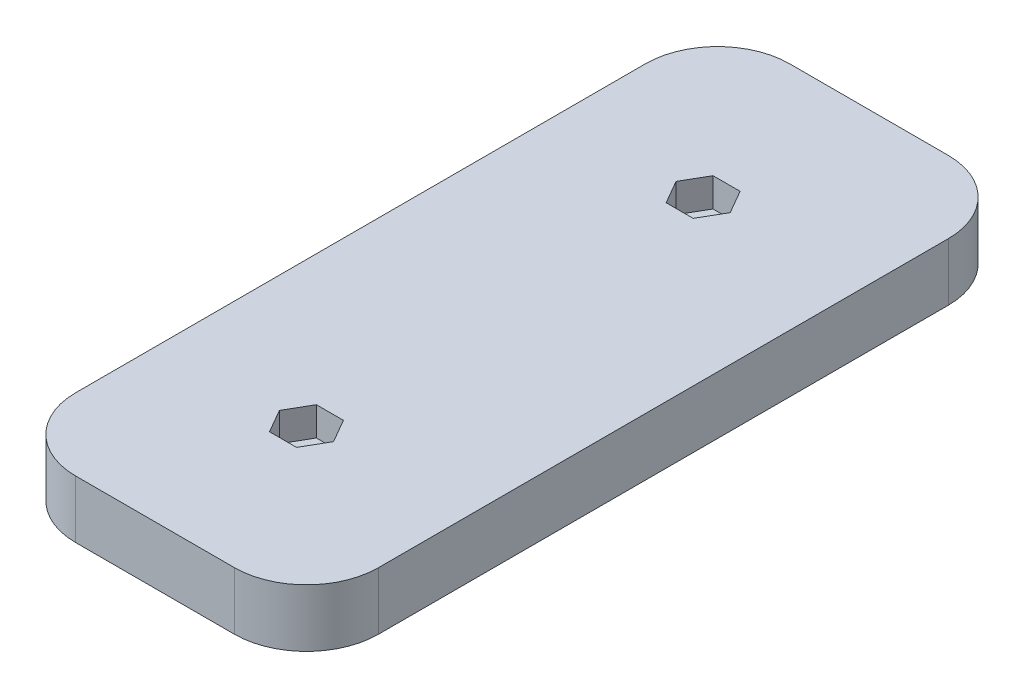
ISO-10303-21;
HEADER;
FILE_DESCRIPTION(('STEP AP214'),'2;1');
FILE_NAME('part.step','',(''),(''),'','','');
FILE_SCHEMA(('AUTOMOTIVE_DESIGN { 1 0 10303 214 1 1 1 1 }'));
ENDSEC;
DATA;
#1=APPLICATION_CONTEXT('core data for automotive mechanical design processes');
#2=APPLICATION_PROTOCOL_DEFINITION('international standard','automotive_design',2000,#1);
#3=PRODUCT_CONTEXT('',#1,'mechanical');
#4=PRODUCT('Part','Part','',(#3));
#5=PRODUCT_RELATED_PRODUCT_CATEGORY('part','',(#4));
#6=PRODUCT_DEFINITION_FORMATION('','',#4);
#7=PRODUCT_DEFINITION_CONTEXT('part definition',#1,'design');
#8=PRODUCT_DEFINITION('design','',#6,#7);
#9=PRODUCT_DEFINITION_SHAPE('','',#8);
#10=(LENGTH_UNIT() NAMED_UNIT(*) SI_UNIT(.MILLI.,.METRE.));
#11=(NAMED_UNIT(*) PLANE_ANGLE_UNIT() SI_UNIT($,.RADIAN.));
#12=(NAMED_UNIT(*) SI_UNIT($,.STERADIAN.) SOLID_ANGLE_UNIT());
#13=UNCERTAINTY_MEASURE_WITH_UNIT(LENGTH_MEASURE(1.E-05),#10,'distance_accuracy_value','');
#14=(GEOMETRIC_REPRESENTATION_CONTEXT(3) GLOBAL_UNCERTAINTY_ASSIGNED_CONTEXT((#13)) GLOBAL_UNIT_ASSIGNED_CONTEXT((#10,
#11,#12)) REPRESENTATION_CONTEXT('',''));
#15=CARTESIAN_POINT('',(0.,0.,0.));
#16=DIRECTION('',(0.,0.,1.));
#17=DIRECTION('',(1.,0.,0.));
#18=AXIS2_PLACEMENT_3D('',#15,#16,#17);
#19=CARTESIAN_POINT('',(20.,8.,-77.));
#20=DIRECTION('',(0.,-1.,0.));
#21=DIRECTION('',(0.,0.,-1.));
#22=AXIS2_PLACEMENT_3D('',#19,#20,#21);
#23=CYLINDRICAL_SURFACE('',#22,2.00000000000001);
#24=CARTESIAN_POINT('',(20.,0.,-77.));
#25=DIRECTION('',(0.,1.,0.));
#26=DIRECTION('',(0.,0.,1.));
#27=AXIS2_PLACEMENT_3D('',#24,#25,#26);
#28=CIRCLE('',#27,2.00000000000001);
#29=CARTESIAN_POINT('',(20.,0.,-75.));
#30=VERTEX_POINT('',#29);
#31=EDGE_CURVE('E310',#30,#30,#28,.T.);
#32=ORIENTED_EDGE('',*,*,#31,.F.);
#33=EDGE_LOOP('',(#32));
#34=FACE_BOUND('',#33,.T.);
#35=CARTESIAN_POINT('',(20.,4.,-77.));
#36=DIRECTION('',(0.,1.,0.));
#37=DIRECTION('',(0.,0.,1.));
#38=AXIS2_PLACEMENT_3D('',#35,#36,#37);
#39=CIRCLE('',#38,2.00000000000001);
#40=CARTESIAN_POINT('',(20.,4.,-75.));
#41=VERTEX_POINT('',#40);
#42=EDGE_CURVE('E302',#41,#41,#39,.T.);
#43=ORIENTED_EDGE('',*,*,#42,.T.);
#44=EDGE_LOOP('',(#43));
#45=FACE_BOUND('',#44,.T.);
#46=ADVANCED_FACE('F39',(#34,#45),#23,.F.);
#47=CARTESIAN_POINT('',(20.,8.,-22.));
#48=DIRECTION('',(0.,-1.,0.));
#49=DIRECTION('',(0.,0.,-1.));
#50=AXIS2_PLACEMENT_3D('',#47,#48,#49);
#51=CYLINDRICAL_SURFACE('',#50,2.00000000000001);
#52=CARTESIAN_POINT('',(20.,0.,-22.));
#53=DIRECTION('',(0.,1.,0.));
#54=DIRECTION('',(0.,0.,1.));
#55=AXIS2_PLACEMENT_3D('',#52,#53,#54);
#56=CIRCLE('',#55,2.00000000000001);
#57=CARTESIAN_POINT('',(20.,0.,-20.));
#58=VERTEX_POINT('',#57);
#59=EDGE_CURVE('E289',#58,#58,#56,.F.);
#60=ORIENTED_EDGE('',*,*,#59,.T.);
#61=EDGE_LOOP('',(#60));
#62=FACE_BOUND('',#61,.T.);
#63=CARTESIAN_POINT('',(20.,4.,-22.));
#64=DIRECTION('',(0.,1.,0.));
#65=DIRECTION('',(0.,0.,1.));
#66=AXIS2_PLACEMENT_3D('',#63,#64,#65);
#67=CIRCLE('',#66,2.00000000000001);
#68=CARTESIAN_POINT('',(20.,4.,-20.));
#69=VERTEX_POINT('',#68);
#70=EDGE_CURVE('E231',#69,#69,#67,.F.);
#71=ORIENTED_EDGE('',*,*,#70,.F.);
#72=EDGE_LOOP('',(#71));
#73=FACE_BOUND('',#72,.T.);
#74=ADVANCED_FACE('F388',(#62,#73),#51,.F.);
#75=CARTESIAN_POINT('',(0.,8.,0.));
#76=DIRECTION('',(0.,0.,-1.));
#77=DIRECTION('',(-1.,0.,0.));
#78=AXIS2_PLACEMENT_3D('',#75,#76,#77);
#79=PLANE('',#78);
#80=DIRECTION('',(1.,0.,0.));
#81=VECTOR('',#80,1.);
#82=CARTESIAN_POINT('',(0.,8.,0.));
#83=LINE('',#82,#81);
#84=CARTESIAN_POINT('',(10.,8.,0.));
#85=VERTEX_POINT('',#84);
#86=CARTESIAN_POINT('',(32.,8.,0.));
#87=VERTEX_POINT('',#86);
#88=EDGE_CURVE('E286',#85,#87,#83,.T.);
#89=ORIENTED_EDGE('',*,*,#88,.F.);
#90=DIRECTION('',(0.,-1.,0.));
#91=VECTOR('',#90,1.);
#92=CARTESIAN_POINT('',(10.,0.,0.));
#93=LINE('',#92,#91);
#94=CARTESIAN_POINT('',(10.,0.,0.));
#95=VERTEX_POINT('',#94);
#96=EDGE_CURVE('E11',#85,#95,#93,.T.);
#97=ORIENTED_EDGE('',*,*,#96,.T.);
#98=DIRECTION('',(1.,0.,0.));
#99=VECTOR('',#98,1.);
#100=CARTESIAN_POINT('',(0.,0.,0.));
#101=LINE('',#100,#99);
#102=CARTESIAN_POINT('',(32.,0.,0.));
#103=VERTEX_POINT('',#102);
#104=EDGE_CURVE('E298',#95,#103,#101,.T.);
#105=ORIENTED_EDGE('',*,*,#104,.T.);
#106=DIRECTION('',(0.,-1.,0.));
#107=VECTOR('',#106,1.);
#108=CARTESIAN_POINT('',(32.,8.,0.));
#109=LINE('',#108,#107);
#110=EDGE_CURVE('E47',#103,#87,#109,.F.);
#111=ORIENTED_EDGE('',*,*,#110,.T.);
#112=EDGE_LOOP('',(#89,#97,#105,#111));
#113=FACE_BOUND('',#112,.T.);
#114=ADVANCED_FACE('F349',(#113),#79,.F.);
#115=CARTESIAN_POINT('',(42.,8.,0.));
#116=DIRECTION('',(-1.,0.,0.));
#117=DIRECTION('',(0.,0.,1.));
#118=AXIS2_PLACEMENT_3D('',#115,#116,#117);
#119=PLANE('',#118);
#120=DIRECTION('',(0.,0.,-1.));
#121=VECTOR('',#120,1.);
#122=CARTESIAN_POINT('',(42.,0.,0.));
#123=LINE('',#122,#121);
#124=CARTESIAN_POINT('',(42.,0.,-10.));
#125=VERTEX_POINT('',#124);
#126=CARTESIAN_POINT('',(42.,0.,-89.));
#127=VERTEX_POINT('',#126);
#128=EDGE_CURVE('E301',#125,#127,#123,.T.);
#129=ORIENTED_EDGE('',*,*,#128,.T.);
#130=DIRECTION('',(0.,-1.,0.));
#131=VECTOR('',#130,1.);
#132=CARTESIAN_POINT('',(42.,8.,-89.));
#133=LINE('',#132,#131);
#134=CARTESIAN_POINT('',(42.,8.,-89.));
#135=VERTEX_POINT('',#134);
#136=EDGE_CURVE('E54',#127,#135,#133,.F.);
#137=ORIENTED_EDGE('',*,*,#136,.T.);
#138=DIRECTION('',(0.,0.,-1.));
#139=VECTOR('',#138,1.);
#140=CARTESIAN_POINT('',(42.,8.,0.));
#141=LINE('',#140,#139);
#142=CARTESIAN_POINT('',(42.,8.,-10.));
#143=VERTEX_POINT('',#142);
#144=EDGE_CURVE('E288',#143,#135,#141,.T.);
#145=ORIENTED_EDGE('',*,*,#144,.F.);
#146=DIRECTION('',(0.,-1.,0.));
#147=VECTOR('',#146,1.);
#148=CARTESIAN_POINT('',(42.,8.,-10.));
#149=LINE('',#148,#147);
#150=EDGE_CURVE('E343',#143,#125,#149,.T.);
#151=ORIENTED_EDGE('',*,*,#150,.T.);
#152=EDGE_LOOP('',(#129,#137,#145,#151));
#153=FACE_BOUND('',#152,.T.);
#154=ADVANCED_FACE('F359',(#153),#119,.F.);
#155=CARTESIAN_POINT('',(0.,8.,-99.));
#156=DIRECTION('',(0.,0.,-1.));
#157=DIRECTION('',(-1.,0.,0.));
#158=AXIS2_PLACEMENT_3D('',#155,#156,#157);
#159=PLANE('',#158);
#160=DIRECTION('',(1.,0.,0.));
#161=VECTOR('',#160,1.);
#162=CARTESIAN_POINT('',(0.,0.,-99.));
#163=LINE('',#162,#161);
#164=CARTESIAN_POINT('',(10.,0.,-99.));
#165=VERTEX_POINT('',#164);
#166=CARTESIAN_POINT('',(32.,0.,-99.));
#167=VERTEX_POINT('',#166);
#168=EDGE_CURVE('E304',#165,#167,#163,.T.);
#169=ORIENTED_EDGE('',*,*,#168,.F.);
#170=DIRECTION('',(0.,-1.,0.));
#171=VECTOR('',#170,1.);
#172=CARTESIAN_POINT('',(10.,8.,-99.));
#173=LINE('',#172,#171);
#174=CARTESIAN_POINT('',(10.,8.,-99.));
#175=VERTEX_POINT('',#174);
#176=EDGE_CURVE('E334',#165,#175,#173,.F.);
#177=ORIENTED_EDGE('',*,*,#176,.T.);
#178=DIRECTION('',(1.,0.,0.));
#179=VECTOR('',#178,1.);
#180=CARTESIAN_POINT('',(0.,8.,-99.));
#181=LINE('',#180,#179);
#182=CARTESIAN_POINT('',(32.,8.,-99.));
#183=VERTEX_POINT('',#182);
#184=EDGE_CURVE('E291',#175,#183,#181,.T.);
#185=ORIENTED_EDGE('',*,*,#184,.T.);
#186=DIRECTION('',(0.,-1.,0.));
#187=VECTOR('',#186,1.);
#188=CARTESIAN_POINT('',(32.,0.,-99.));
#189=LINE('',#188,#187);
#190=EDGE_CURVE('E331',#183,#167,#189,.T.);
#191=ORIENTED_EDGE('',*,*,#190,.T.);
#192=EDGE_LOOP('',(#169,#177,#185,#191));
#193=FACE_BOUND('',#192,.T.);
#194=ADVANCED_FACE('F369',(#193),#159,.T.);
#195=CARTESIAN_POINT('',(0.,8.,0.));
#196=DIRECTION('',(-1.,0.,0.));
#197=DIRECTION('',(0.,0.,1.));
#198=AXIS2_PLACEMENT_3D('',#195,#196,#197);
#199=PLANE('',#198);
#200=DIRECTION('',(0.,0.,-1.));
#201=VECTOR('',#200,1.);
#202=CARTESIAN_POINT('',(0.,8.,0.));
#203=LINE('',#202,#201);
#204=CARTESIAN_POINT('',(0.,8.,-10.));
#205=VERTEX_POINT('',#204);
#206=CARTESIAN_POINT('',(0.,8.,-89.));
#207=VERTEX_POINT('',#206);
#208=EDGE_CURVE('E294',#205,#207,#203,.T.);
#209=ORIENTED_EDGE('',*,*,#208,.T.);
#210=DIRECTION('',(0.,-1.,0.));
#211=VECTOR('',#210,1.);
#212=CARTESIAN_POINT('',(0.,8.,-89.));
#213=LINE('',#212,#211);
#214=CARTESIAN_POINT('',(0.,0.,-89.));
#215=VERTEX_POINT('',#214);
#216=EDGE_CURVE('E320',#207,#215,#213,.T.);
#217=ORIENTED_EDGE('',*,*,#216,.T.);
#218=DIRECTION('',(0.,0.,-1.));
#219=VECTOR('',#218,1.);
#220=CARTESIAN_POINT('',(0.,0.,0.));
#221=LINE('',#220,#219);
#222=CARTESIAN_POINT('',(0.,0.,-10.));
#223=VERTEX_POINT('',#222);
#224=EDGE_CURVE('E307',#223,#215,#221,.T.);
#225=ORIENTED_EDGE('',*,*,#224,.F.);
#226=DIRECTION('',(0.,-1.,0.));
#227=VECTOR('',#226,1.);
#228=CARTESIAN_POINT('',(0.,8.,-10.));
#229=LINE('',#228,#227);
#230=EDGE_CURVE('E297',#223,#205,#229,.F.);
#231=ORIENTED_EDGE('',*,*,#230,.T.);
#232=EDGE_LOOP('',(#209,#217,#225,#231));
#233=FACE_BOUND('',#232,.T.);
#234=ADVANCED_FACE('F377',(#233),#199,.T.);
#235=CARTESIAN_POINT('',(0.,8.,0.));
#236=DIRECTION('',(0.,1.,0.));
#237=DIRECTION('',(0.,0.,1.));
#238=AXIS2_PLACEMENT_3D('',#235,#236,#237);
#239=PLANE('',#238);
#240=DIRECTION('',(0.5,0.,-0.866025403784439));
#241=VECTOR('',#240,1.);
#242=CARTESIAN_POINT('',(21.8763883748663,8.,-18.75));
#243=LINE('',#242,#241);
#244=CARTESIAN_POINT('',(21.8763883748663,8.,-18.75));
#245=VERTEX_POINT('',#244);
#246=CARTESIAN_POINT('',(23.7527767497326,8.,-22.));
#247=VERTEX_POINT('',#246);
#248=EDGE_CURVE('E185',#245,#247,#243,.T.);
#249=ORIENTED_EDGE('',*,*,#248,.F.);
#250=DIRECTION('',(1.,0.,0.));
#251=VECTOR('',#250,1.);
#252=CARTESIAN_POINT('',(18.1236116251337,8.,-18.75));
#253=LINE('',#252,#251);
#254=CARTESIAN_POINT('',(18.1236116251337,8.,-18.75));
#255=VERTEX_POINT('',#254);
#256=EDGE_CURVE('E204',#255,#245,#253,.T.);
#257=ORIENTED_EDGE('',*,*,#256,.F.);
#258=DIRECTION('',(0.5,0.,0.866025403784439));
#259=VECTOR('',#258,1.);
#260=CARTESIAN_POINT('',(16.2472232502674,8.,-22.));
#261=LINE('',#260,#259);
#262=CARTESIAN_POINT('',(16.2472232502674,8.,-22.));
#263=VERTEX_POINT('',#262);
#264=EDGE_CURVE('E207',#263,#255,#261,.T.);
#265=ORIENTED_EDGE('',*,*,#264,.F.);
#266=DIRECTION('',(-0.5,0.,0.866025403784439));
#267=VECTOR('',#266,1.);
#268=CARTESIAN_POINT('',(18.1236116251337,8.,-25.25));
#269=LINE('',#268,#267);
#270=CARTESIAN_POINT('',(18.1236116251337,8.,-25.25));
#271=VERTEX_POINT('',#270);
#272=EDGE_CURVE('E224',#271,#263,#269,.T.);
#273=ORIENTED_EDGE('',*,*,#272,.F.);
#274=DIRECTION('',(-1.,0.,0.));
#275=VECTOR('',#274,1.);
#276=CARTESIAN_POINT('',(21.8763883748663,8.,-25.25));
#277=LINE('',#276,#275);
#278=CARTESIAN_POINT('',(21.8763883748663,8.,-25.25));
#279=VERTEX_POINT('',#278);
#280=EDGE_CURVE('E221',#279,#271,#277,.T.);
#281=ORIENTED_EDGE('',*,*,#280,.F.);
#282=DIRECTION('',(-0.5,0.,-0.866025403784439));
#283=VECTOR('',#282,1.);
#284=CARTESIAN_POINT('',(23.7527767497326,8.,-22.));
#285=LINE('',#284,#283);
#286=EDGE_CURVE('E218',#247,#279,#285,.T.);
#287=ORIENTED_EDGE('',*,*,#286,.F.);
#288=EDGE_LOOP('',(#249,#257,#265,#273,#281,#287));
#289=FACE_BOUND('',#288,.T.);
#290=DIRECTION('',(0.500000000000001,0.,-0.866025403784438));
#291=VECTOR('',#290,1.);
#292=CARTESIAN_POINT('',(21.8763883748663,8.,-73.75));
#293=LINE('',#292,#291);
#294=CARTESIAN_POINT('',(21.8763883748663,8.,-73.75));
#295=VERTEX_POINT('',#294);
#296=CARTESIAN_POINT('',(23.7527767497326,8.,-77.));
#297=VERTEX_POINT('',#296);
#298=EDGE_CURVE('E219',#295,#297,#293,.T.);
#299=ORIENTED_EDGE('',*,*,#298,.F.);
#300=DIRECTION('',(1.,0.,0.));
#301=VECTOR('',#300,1.);
#302=CARTESIAN_POINT('',(18.1236116251337,8.,-73.75));
#303=LINE('',#302,#301);
#304=CARTESIAN_POINT('',(18.1236116251337,8.,-73.75));
#305=VERTEX_POINT('',#304);
#306=EDGE_CURVE('E253',#305,#295,#303,.T.);
#307=ORIENTED_EDGE('',*,*,#306,.F.);
#308=DIRECTION('',(0.5,0.,0.866025403784439));
#309=VECTOR('',#308,1.);
#310=CARTESIAN_POINT('',(16.2472232502674,8.,-77.));
#311=LINE('',#310,#309);
#312=CARTESIAN_POINT('',(16.2472232502674,8.,-77.));
#313=VERTEX_POINT('',#312);
#314=EDGE_CURVE('E256',#313,#305,#311,.T.);
#315=ORIENTED_EDGE('',*,*,#314,.F.);
#316=DIRECTION('',(-0.499999999999999,0.,0.866025403784439));
#317=VECTOR('',#316,1.);
#318=CARTESIAN_POINT('',(18.1236116251337,8.,-80.25));
#319=LINE('',#318,#317);
#320=CARTESIAN_POINT('',(18.1236116251337,8.,-80.25));
#321=VERTEX_POINT('',#320);
#322=EDGE_CURVE('E260',#321,#313,#319,.T.);
#323=ORIENTED_EDGE('',*,*,#322,.F.);
#324=DIRECTION('',(-1.,0.,0.));
#325=VECTOR('',#324,1.);
#326=CARTESIAN_POINT('',(21.8763883748663,8.,-80.25));
#327=LINE('',#326,#325);
#328=CARTESIAN_POINT('',(21.8763883748663,8.,-80.25));
#329=VERTEX_POINT('',#328);
#330=EDGE_CURVE('E263',#329,#321,#327,.T.);
#331=ORIENTED_EDGE('',*,*,#330,.F.);
#332=DIRECTION('',(-0.5,0.,-0.866025403784439));
#333=VECTOR('',#332,1.);
#334=CARTESIAN_POINT('',(23.7527767497326,8.,-77.));
#335=LINE('',#334,#333);
#336=EDGE_CURVE('E266',#297,#329,#335,.T.);
#337=ORIENTED_EDGE('',*,*,#336,.F.);
#338=EDGE_LOOP('',(#299,#307,#315,#323,#331,#337));
#339=FACE_BOUND('',#338,.T.);
#340=ORIENTED_EDGE('',*,*,#184,.F.);
#341=CARTESIAN_POINT('',(10.,8.,-89.));
#342=DIRECTION('',(0.,1.,0.));
#343=DIRECTION('',(0.,0.,1.));
#344=AXIS2_PLACEMENT_3D('',#341,#342,#343);
#345=CIRCLE('',#344,10.);
#346=EDGE_CURVE('E341',#175,#207,#345,.T.);
#347=ORIENTED_EDGE('',*,*,#346,.T.);
#348=ORIENTED_EDGE('',*,*,#208,.F.);
#349=CARTESIAN_POINT('',(10.,8.,-10.));
#350=DIRECTION('',(0.,1.,0.));
#351=DIRECTION('',(0.,0.,1.));
#352=AXIS2_PLACEMENT_3D('',#349,#350,#351);
#353=CIRCLE('',#352,10.);
#354=EDGE_CURVE('E337',#205,#85,#353,.T.);
#355=ORIENTED_EDGE('',*,*,#354,.T.);
#356=ORIENTED_EDGE('',*,*,#88,.T.);
#357=CARTESIAN_POINT('',(32.,8.,-10.));
#358=DIRECTION('',(0.,1.,0.));
#359=DIRECTION('',(0.,0.,1.));
#360=AXIS2_PLACEMENT_3D('',#357,#358,#359);
#361=CIRCLE('',#360,10.);
#362=EDGE_CURVE('E61',#87,#143,#361,.T.);
#363=ORIENTED_EDGE('',*,*,#362,.T.);
#364=ORIENTED_EDGE('',*,*,#144,.T.);
#365=CARTESIAN_POINT('',(32.,8.,-89.));
#366=DIRECTION('',(0.,1.,0.));
#367=DIRECTION('',(0.,0.,1.));
#368=AXIS2_PLACEMENT_3D('',#365,#366,#367);
#369=CIRCLE('',#368,10.);
#370=EDGE_CURVE('E339',#135,#183,#369,.T.);
#371=ORIENTED_EDGE('',*,*,#370,.T.);
#372=EDGE_LOOP('',(#340,#347,#348,#355,#356,#363,#364,#371));
#373=FACE_BOUND('',#372,.T.);
#374=ADVANCED_FACE('F354',(#289,#339,#373),#239,.T.);
#375=CARTESIAN_POINT('',(0.,0.,0.));
#376=DIRECTION('',(0.,1.,0.));
#377=DIRECTION('',(0.,0.,1.));
#378=AXIS2_PLACEMENT_3D('',#375,#376,#377);
#379=PLANE('',#378);
#380=ORIENTED_EDGE('',*,*,#224,.T.);
#381=CARTESIAN_POINT('',(10.,0.,-89.));
#382=DIRECTION('',(0.,1.,0.));
#383=DIRECTION('',(0.,0.,1.));
#384=AXIS2_PLACEMENT_3D('',#381,#382,#383);
#385=CIRCLE('',#384,10.);
#386=EDGE_CURVE('E329',#215,#165,#385,.F.);
#387=ORIENTED_EDGE('',*,*,#386,.T.);
#388=ORIENTED_EDGE('',*,*,#168,.T.);
#389=CARTESIAN_POINT('',(32.,0.,-89.));
#390=DIRECTION('',(0.,1.,0.));
#391=DIRECTION('',(0.,0.,1.));
#392=AXIS2_PLACEMENT_3D('',#389,#390,#391);
#393=CIRCLE('',#392,10.);
#394=EDGE_CURVE('E327',#167,#127,#393,.F.);
#395=ORIENTED_EDGE('',*,*,#394,.T.);
#396=ORIENTED_EDGE('',*,*,#128,.F.);
#397=CARTESIAN_POINT('',(32.,0.,-10.));
#398=DIRECTION('',(0.,1.,0.));
#399=DIRECTION('',(0.,0.,1.));
#400=AXIS2_PLACEMENT_3D('',#397,#398,#399);
#401=CIRCLE('',#400,10.);
#402=EDGE_CURVE('E323',#125,#103,#401,.F.);
#403=ORIENTED_EDGE('',*,*,#402,.T.);
#404=ORIENTED_EDGE('',*,*,#104,.F.);
#405=CARTESIAN_POINT('',(10.,0.,-10.));
#406=DIRECTION('',(0.,1.,0.));
#407=DIRECTION('',(0.,0.,1.));
#408=AXIS2_PLACEMENT_3D('',#405,#406,#407);
#409=CIRCLE('',#408,10.);
#410=EDGE_CURVE('E325',#95,#223,#409,.F.);
#411=ORIENTED_EDGE('',*,*,#410,.T.);
#412=EDGE_LOOP('',(#380,#387,#388,#395,#396,#403,#404,#411));
#413=FACE_BOUND('',#412,.T.);
#414=ORIENTED_EDGE('',*,*,#31,.T.);
#415=EDGE_LOOP('',(#414));
#416=FACE_BOUND('',#415,.T.);
#417=ORIENTED_EDGE('',*,*,#59,.F.);
#418=EDGE_LOOP('',(#417));
#419=FACE_BOUND('',#418,.T.);
#420=ADVANCED_FACE('F361',(#413,#416,#419),#379,.F.);
#421=CARTESIAN_POINT('',(21.8763883748663,4.,-73.75));
#422=DIRECTION('',(0.866025403784438,0.,0.500000000000001));
#423=DIRECTION('',(0.500000000000001,0.,-0.866025403784438));
#424=AXIS2_PLACEMENT_3D('',#421,#422,#423);
#425=PLANE('',#424);
#426=ORIENTED_EDGE('',*,*,#298,.T.);
#427=DIRECTION('',(0.,1.,0.));
#428=VECTOR('',#427,1.);
#429=CARTESIAN_POINT('',(23.7527767497326,4.,-77.));
#430=LINE('',#429,#428);
#431=CARTESIAN_POINT('',(23.7527767497326,4.,-77.));
#432=VERTEX_POINT('',#431);
#433=EDGE_CURVE('E239',#432,#297,#430,.T.);
#434=ORIENTED_EDGE('',*,*,#433,.F.);
#435=DIRECTION('',(0.500000000000001,0.,-0.866025403784438));
#436=VECTOR('',#435,1.);
#437=CARTESIAN_POINT('',(21.8763883748663,4.,-73.75));
#438=LINE('',#437,#436);
#439=CARTESIAN_POINT('',(21.8763883748663,4.,-73.75));
#440=VERTEX_POINT('',#439);
#441=EDGE_CURVE('E257',#440,#432,#438,.T.);
#442=ORIENTED_EDGE('',*,*,#441,.F.);
#443=DIRECTION('',(0.,1.,0.));
#444=VECTOR('',#443,1.);
#445=CARTESIAN_POINT('',(21.8763883748663,4.,-73.75));
#446=LINE('',#445,#444);
#447=EDGE_CURVE('E251',#440,#295,#446,.T.);
#448=ORIENTED_EDGE('',*,*,#447,.T.);
#449=EDGE_LOOP('',(#426,#434,#442,#448));
#450=FACE_BOUND('',#449,.T.);
#451=ADVANCED_FACE('F425',(#450),#425,.F.);
#452=CARTESIAN_POINT('',(18.1236116251337,4.,-73.75));
#453=DIRECTION('',(0.,0.,1.));
#454=DIRECTION('',(1.,0.,0.));
#455=AXIS2_PLACEMENT_3D('',#452,#453,#454);
#456=PLANE('',#455);
#457=ORIENTED_EDGE('',*,*,#306,.T.);
#458=ORIENTED_EDGE('',*,*,#447,.F.);
#459=DIRECTION('',(1.,0.,0.));
#460=VECTOR('',#459,1.);
#461=CARTESIAN_POINT('',(18.1236116251337,4.,-73.75));
#462=LINE('',#461,#460);
#463=CARTESIAN_POINT('',(18.1236116251337,4.,-73.75));
#464=VERTEX_POINT('',#463);
#465=EDGE_CURVE('E242',#464,#440,#462,.T.);
#466=ORIENTED_EDGE('',*,*,#465,.F.);
#467=DIRECTION('',(0.,1.,0.));
#468=VECTOR('',#467,1.);
#469=CARTESIAN_POINT('',(18.1236116251337,4.,-73.75));
#470=LINE('',#469,#468);
#471=EDGE_CURVE('E249',#464,#305,#470,.T.);
#472=ORIENTED_EDGE('',*,*,#471,.T.);
#473=EDGE_LOOP('',(#457,#458,#466,#472));
#474=FACE_BOUND('',#473,.T.);
#475=ADVANCED_FACE('F428',(#474),#456,.F.);
#476=CARTESIAN_POINT('',(16.2472232502674,4.,-77.));
#477=DIRECTION('',(-0.866025403784439,0.,0.5));
#478=DIRECTION('',(0.5,0.,0.866025403784439));
#479=AXIS2_PLACEMENT_3D('',#476,#477,#478);
#480=PLANE('',#479);
#481=ORIENTED_EDGE('',*,*,#314,.T.);
#482=ORIENTED_EDGE('',*,*,#471,.F.);
#483=DIRECTION('',(0.5,0.,0.866025403784439));
#484=VECTOR('',#483,1.);
#485=CARTESIAN_POINT('',(16.2472232502674,4.,-77.));
#486=LINE('',#485,#484);
#487=CARTESIAN_POINT('',(16.2472232502674,4.,-77.));
#488=VERTEX_POINT('',#487);
#489=EDGE_CURVE('E272',#488,#464,#486,.T.);
#490=ORIENTED_EDGE('',*,*,#489,.F.);
#491=DIRECTION('',(0.,1.,0.));
#492=VECTOR('',#491,1.);
#493=CARTESIAN_POINT('',(16.2472232502674,4.,-77.));
#494=LINE('',#493,#492);
#495=EDGE_CURVE('E247',#488,#313,#494,.T.);
#496=ORIENTED_EDGE('',*,*,#495,.T.);
#497=EDGE_LOOP('',(#481,#482,#490,#496));
#498=FACE_BOUND('',#497,.T.);
#499=ADVANCED_FACE('F442',(#498),#480,.F.);
#500=CARTESIAN_POINT('',(18.1236116251337,4.,-80.25));
#501=DIRECTION('',(-0.866025403784439,0.,-0.499999999999999));
#502=DIRECTION('',(-0.499999999999999,0.,0.866025403784439));
#503=AXIS2_PLACEMENT_3D('',#500,#501,#502);
#504=PLANE('',#503);
#505=ORIENTED_EDGE('',*,*,#322,.T.);
#506=ORIENTED_EDGE('',*,*,#495,.F.);
#507=DIRECTION('',(-0.499999999999999,0.,0.866025403784439));
#508=VECTOR('',#507,1.);
#509=CARTESIAN_POINT('',(18.1236116251337,4.,-80.25));
#510=LINE('',#509,#508);
#511=CARTESIAN_POINT('',(18.1236116251337,4.,-80.25));
#512=VERTEX_POINT('',#511);
#513=EDGE_CURVE('E275',#512,#488,#510,.T.);
#514=ORIENTED_EDGE('',*,*,#513,.F.);
#515=DIRECTION('',(0.,1.,0.));
#516=VECTOR('',#515,1.);
#517=CARTESIAN_POINT('',(18.1236116251337,4.,-80.25));
#518=LINE('',#517,#516);
#519=EDGE_CURVE('E245',#512,#321,#518,.T.);
#520=ORIENTED_EDGE('',*,*,#519,.T.);
#521=EDGE_LOOP('',(#505,#506,#514,#520));
#522=FACE_BOUND('',#521,.T.);
#523=ADVANCED_FACE('F438',(#522),#504,.F.);
#524=CARTESIAN_POINT('',(21.8763883748663,4.,-80.25));
#525=DIRECTION('',(0.,0.,-1.));
#526=DIRECTION('',(-1.,0.,0.));
#527=AXIS2_PLACEMENT_3D('',#524,#525,#526);
#528=PLANE('',#527);
#529=ORIENTED_EDGE('',*,*,#330,.T.);
#530=ORIENTED_EDGE('',*,*,#519,.F.);
#531=DIRECTION('',(-1.,0.,0.));
#532=VECTOR('',#531,1.);
#533=CARTESIAN_POINT('',(21.8763883748663,4.,-80.25));
#534=LINE('',#533,#532);
#535=CARTESIAN_POINT('',(21.8763883748663,4.,-80.25));
#536=VERTEX_POINT('',#535);
#537=EDGE_CURVE('E278',#536,#512,#534,.T.);
#538=ORIENTED_EDGE('',*,*,#537,.F.);
#539=DIRECTION('',(0.,1.,0.));
#540=VECTOR('',#539,1.);
#541=CARTESIAN_POINT('',(21.8763883748663,4.,-80.25));
#542=LINE('',#541,#540);
#543=EDGE_CURVE('E243',#536,#329,#542,.T.);
#544=ORIENTED_EDGE('',*,*,#543,.T.);
#545=EDGE_LOOP('',(#529,#530,#538,#544));
#546=FACE_BOUND('',#545,.T.);
#547=ADVANCED_FACE('F434',(#546),#528,.F.);
#548=CARTESIAN_POINT('',(23.7527767497326,4.,-77.));
#549=DIRECTION('',(0.866025403784439,0.,-0.5));
#550=DIRECTION('',(-0.5,0.,-0.866025403784439));
#551=AXIS2_PLACEMENT_3D('',#548,#549,#550);
#552=PLANE('',#551);
#553=ORIENTED_EDGE('',*,*,#336,.T.);
#554=ORIENTED_EDGE('',*,*,#543,.F.);
#555=DIRECTION('',(-0.5,0.,-0.866025403784439));
#556=VECTOR('',#555,1.);
#557=CARTESIAN_POINT('',(23.7527767497326,4.,-77.));
#558=LINE('',#557,#556);
#559=EDGE_CURVE('E281',#432,#536,#558,.T.);
#560=ORIENTED_EDGE('',*,*,#559,.F.);
#561=ORIENTED_EDGE('',*,*,#433,.T.);
#562=EDGE_LOOP('',(#553,#554,#560,#561));
#563=FACE_BOUND('',#562,.T.);
#564=ADVANCED_FACE('F430',(#563),#552,.F.);
#565=CARTESIAN_POINT('',(0.,4.,0.));
#566=DIRECTION('',(0.,1.,0.));
#567=DIRECTION('',(0.,0.,1.));
#568=AXIS2_PLACEMENT_3D('',#565,#566,#567);
#569=PLANE('',#568);
#570=ORIENTED_EDGE('',*,*,#42,.F.);
#571=EDGE_LOOP('',(#570));
#572=FACE_BOUND('',#571,.T.);
#573=ORIENTED_EDGE('',*,*,#441,.T.);
#574=ORIENTED_EDGE('',*,*,#559,.T.);
#575=ORIENTED_EDGE('',*,*,#537,.T.);
#576=ORIENTED_EDGE('',*,*,#513,.T.);
#577=ORIENTED_EDGE('',*,*,#489,.T.);
#578=ORIENTED_EDGE('',*,*,#465,.T.);
#579=EDGE_LOOP('',(#573,#574,#575,#576,#577,#578));
#580=FACE_BOUND('',#579,.T.);
#581=ADVANCED_FACE('F433',(#572,#580),#569,.T.);
#582=CARTESIAN_POINT('',(0.,4.,0.));
#583=DIRECTION('',(0.,1.,0.));
#584=DIRECTION('',(0.,0.,1.));
#585=AXIS2_PLACEMENT_3D('',#582,#583,#584);
#586=PLANE('',#585);
#587=DIRECTION('',(0.5,0.,-0.866025403784439));
#588=VECTOR('',#587,1.);
#589=CARTESIAN_POINT('',(21.8763883748663,4.,-18.75));
#590=LINE('',#589,#588);
#591=CARTESIAN_POINT('',(21.8763883748663,4.,-18.75));
#592=VERTEX_POINT('',#591);
#593=CARTESIAN_POINT('',(23.7527767497326,4.,-22.));
#594=VERTEX_POINT('',#593);
#595=EDGE_CURVE('E182',#592,#594,#590,.T.);
#596=ORIENTED_EDGE('',*,*,#595,.T.);
#597=DIRECTION('',(-0.5,0.,-0.866025403784439));
#598=VECTOR('',#597,1.);
#599=CARTESIAN_POINT('',(23.7527767497326,4.,-22.));
#600=LINE('',#599,#598);
#601=CARTESIAN_POINT('',(21.8763883748663,4.,-25.25));
#602=VERTEX_POINT('',#601);
#603=EDGE_CURVE('E193',#594,#602,#600,.T.);
#604=ORIENTED_EDGE('',*,*,#603,.T.);
#605=DIRECTION('',(-1.,0.,0.));
#606=VECTOR('',#605,1.);
#607=CARTESIAN_POINT('',(21.8763883748663,4.,-25.25));
#608=LINE('',#607,#606);
#609=CARTESIAN_POINT('',(18.1236116251337,4.,-25.25));
#610=VERTEX_POINT('',#609);
#611=EDGE_CURVE('E198',#602,#610,#608,.T.);
#612=ORIENTED_EDGE('',*,*,#611,.T.);
#613=DIRECTION('',(-0.5,0.,0.866025403784439));
#614=VECTOR('',#613,1.);
#615=CARTESIAN_POINT('',(18.1236116251337,4.,-25.25));
#616=LINE('',#615,#614);
#617=CARTESIAN_POINT('',(16.2472232502674,4.,-22.));
#618=VERTEX_POINT('',#617);
#619=EDGE_CURVE('E211',#610,#618,#616,.T.);
#620=ORIENTED_EDGE('',*,*,#619,.T.);
#621=DIRECTION('',(0.5,0.,0.866025403784439));
#622=VECTOR('',#621,1.);
#623=CARTESIAN_POINT('',(16.2472232502674,4.,-22.));
#624=LINE('',#623,#622);
#625=CARTESIAN_POINT('',(18.1236116251337,4.,-18.75));
#626=VERTEX_POINT('',#625);
#627=EDGE_CURVE('E214',#618,#626,#624,.T.);
#628=ORIENTED_EDGE('',*,*,#627,.T.);
#629=DIRECTION('',(1.,0.,0.));
#630=VECTOR('',#629,1.);
#631=CARTESIAN_POINT('',(18.1236116251337,4.,-18.75));
#632=LINE('',#631,#630);
#633=EDGE_CURVE('E190',#626,#592,#632,.T.);
#634=ORIENTED_EDGE('',*,*,#633,.T.);
#635=EDGE_LOOP('',(#596,#604,#612,#620,#628,#634));
#636=FACE_BOUND('',#635,.T.);
#637=ORIENTED_EDGE('',*,*,#70,.T.);
#638=EDGE_LOOP('',(#637));
#639=FACE_BOUND('',#638,.T.);
#640=ADVANCED_FACE('F200',(#636,#639),#586,.T.);
#641=CARTESIAN_POINT('',(21.8763883748663,4.,-18.75));
#642=DIRECTION('',(0.866025403784439,0.,0.5));
#643=DIRECTION('',(0.5,0.,-0.866025403784439));
#644=AXIS2_PLACEMENT_3D('',#641,#642,#643);
#645=PLANE('',#644);
#646=ORIENTED_EDGE('',*,*,#248,.T.);
#647=DIRECTION('',(0.,1.,0.));
#648=VECTOR('',#647,1.);
#649=CARTESIAN_POINT('',(23.7527767497326,4.,-22.));
#650=LINE('',#649,#648);
#651=EDGE_CURVE('E178',#594,#247,#650,.T.);
#652=ORIENTED_EDGE('',*,*,#651,.F.);
#653=ORIENTED_EDGE('',*,*,#595,.F.);
#654=DIRECTION('',(0.,1.,0.));
#655=VECTOR('',#654,1.);
#656=CARTESIAN_POINT('',(21.8763883748663,4.,-18.75));
#657=LINE('',#656,#655);
#658=EDGE_CURVE('E229',#592,#245,#657,.T.);
#659=ORIENTED_EDGE('',*,*,#658,.T.);
#660=EDGE_LOOP('',(#646,#652,#653,#659));
#661=FACE_BOUND('',#660,.T.);
#662=ADVANCED_FACE('F180',(#661),#645,.F.);
#663=CARTESIAN_POINT('',(18.1236116251337,4.,-18.75));
#664=DIRECTION('',(0.,0.,1.));
#665=DIRECTION('',(1.,0.,0.));
#666=AXIS2_PLACEMENT_3D('',#663,#664,#665);
#667=PLANE('',#666);
#668=ORIENTED_EDGE('',*,*,#256,.T.);
#669=ORIENTED_EDGE('',*,*,#658,.F.);
#670=ORIENTED_EDGE('',*,*,#633,.F.);
#671=DIRECTION('',(0.,1.,0.));
#672=VECTOR('',#671,1.);
#673=CARTESIAN_POINT('',(18.1236116251337,4.,-18.75));
#674=LINE('',#673,#672);
#675=EDGE_CURVE('E232',#626,#255,#674,.T.);
#676=ORIENTED_EDGE('',*,*,#675,.T.);
#677=EDGE_LOOP('',(#668,#669,#670,#676));
#678=FACE_BOUND('',#677,.T.);
#679=ADVANCED_FACE('F424',(#678),#667,.F.);
#680=CARTESIAN_POINT('',(16.2472232502674,4.,-22.));
#681=DIRECTION('',(-0.866025403784439,0.,0.5));
#682=DIRECTION('',(0.5,0.,0.866025403784439));
#683=AXIS2_PLACEMENT_3D('',#680,#681,#682);
#684=PLANE('',#683);
#685=ORIENTED_EDGE('',*,*,#264,.T.);
#686=ORIENTED_EDGE('',*,*,#675,.F.);
#687=ORIENTED_EDGE('',*,*,#627,.F.);
#688=DIRECTION('',(0.,1.,0.));
#689=VECTOR('',#688,1.);
#690=CARTESIAN_POINT('',(16.2472232502674,4.,-22.));
#691=LINE('',#690,#689);
#692=EDGE_CURVE('E234',#618,#263,#691,.T.);
#693=ORIENTED_EDGE('',*,*,#692,.T.);
#694=EDGE_LOOP('',(#685,#686,#687,#693));
#695=FACE_BOUND('',#694,.T.);
#696=ADVANCED_FACE('F505',(#695),#684,.F.);
#697=CARTESIAN_POINT('',(18.1236116251337,4.,-25.25));
#698=DIRECTION('',(-0.866025403784439,0.,-0.5));
#699=DIRECTION('',(-0.5,0.,0.866025403784439));
#700=AXIS2_PLACEMENT_3D('',#697,#698,#699);
#701=PLANE('',#700);
#702=ORIENTED_EDGE('',*,*,#272,.T.);
#703=ORIENTED_EDGE('',*,*,#692,.F.);
#704=ORIENTED_EDGE('',*,*,#619,.F.);
#705=DIRECTION('',(0.,1.,0.));
#706=VECTOR('',#705,1.);
#707=CARTESIAN_POINT('',(18.1236116251337,4.,-25.25));
#708=LINE('',#707,#706);
#709=EDGE_CURVE('E236',#610,#271,#708,.T.);
#710=ORIENTED_EDGE('',*,*,#709,.T.);
#711=EDGE_LOOP('',(#702,#703,#704,#710));
#712=FACE_BOUND('',#711,.T.);
#713=ADVANCED_FACE('F417',(#712),#701,.F.);
#714=CARTESIAN_POINT('',(21.8763883748663,4.,-25.25));
#715=DIRECTION('',(0.,0.,-1.));
#716=DIRECTION('',(-1.,0.,0.));
#717=AXIS2_PLACEMENT_3D('',#714,#715,#716);
#718=PLANE('',#717);
#719=ORIENTED_EDGE('',*,*,#280,.T.);
#720=ORIENTED_EDGE('',*,*,#709,.F.);
#721=ORIENTED_EDGE('',*,*,#611,.F.);
#722=DIRECTION('',(0.,1.,0.));
#723=VECTOR('',#722,1.);
#724=CARTESIAN_POINT('',(21.8763883748663,4.,-25.25));
#725=LINE('',#724,#723);
#726=EDGE_CURVE('E189',#602,#279,#725,.T.);
#727=ORIENTED_EDGE('',*,*,#726,.T.);
#728=EDGE_LOOP('',(#719,#720,#721,#727));
#729=FACE_BOUND('',#728,.T.);
#730=ADVANCED_FACE('F412',(#729),#718,.F.);
#731=CARTESIAN_POINT('',(23.7527767497326,4.,-22.));
#732=DIRECTION('',(0.866025403784439,0.,-0.5));
#733=DIRECTION('',(-0.5,0.,-0.866025403784439));
#734=AXIS2_PLACEMENT_3D('',#731,#732,#733);
#735=PLANE('',#734);
#736=ORIENTED_EDGE('',*,*,#286,.T.);
#737=ORIENTED_EDGE('',*,*,#726,.F.);
#738=ORIENTED_EDGE('',*,*,#603,.F.);
#739=ORIENTED_EDGE('',*,*,#651,.T.);
#740=EDGE_LOOP('',(#736,#737,#738,#739));
#741=FACE_BOUND('',#740,.T.);
#742=ADVANCED_FACE('F194',(#741),#735,.F.);
#743=CARTESIAN_POINT('',(10.,8.,-89.));
#744=DIRECTION('',(0.,-1.,0.));
#745=DIRECTION('',(0.,0.,-1.));
#746=AXIS2_PLACEMENT_3D('',#743,#744,#745);
#747=CYLINDRICAL_SURFACE('',#746,10.);
#748=ORIENTED_EDGE('',*,*,#346,.F.);
#749=ORIENTED_EDGE('',*,*,#176,.F.);
#750=ORIENTED_EDGE('',*,*,#386,.F.);
#751=ORIENTED_EDGE('',*,*,#216,.F.);
#752=EDGE_LOOP('',(#748,#749,#750,#751));
#753=FACE_BOUND('',#752,.T.);
#754=ADVANCED_FACE('F374',(#753),#747,.T.);
#755=CARTESIAN_POINT('',(32.,8.,-89.));
#756=DIRECTION('',(0.,1.,0.));
#757=DIRECTION('',(0.,0.,1.));
#758=AXIS2_PLACEMENT_3D('',#755,#756,#757);
#759=CYLINDRICAL_SURFACE('',#758,10.);
#760=ORIENTED_EDGE('',*,*,#370,.F.);
#761=ORIENTED_EDGE('',*,*,#136,.F.);
#762=ORIENTED_EDGE('',*,*,#394,.F.);
#763=ORIENTED_EDGE('',*,*,#190,.F.);
#764=EDGE_LOOP('',(#760,#761,#762,#763));
#765=FACE_BOUND('',#764,.T.);
#766=ADVANCED_FACE('F367',(#765),#759,.T.);
#767=CARTESIAN_POINT('',(10.,8.,-10.));
#768=DIRECTION('',(0.,1.,0.));
#769=DIRECTION('',(0.,0.,1.));
#770=AXIS2_PLACEMENT_3D('',#767,#768,#769);
#771=CYLINDRICAL_SURFACE('',#770,10.);
#772=ORIENTED_EDGE('',*,*,#354,.F.);
#773=ORIENTED_EDGE('',*,*,#230,.F.);
#774=ORIENTED_EDGE('',*,*,#410,.F.);
#775=ORIENTED_EDGE('',*,*,#96,.F.);
#776=EDGE_LOOP('',(#772,#773,#774,#775));
#777=FACE_BOUND('',#776,.T.);
#778=ADVANCED_FACE('F380',(#777),#771,.T.);
#779=CARTESIAN_POINT('',(32.,8.,-10.));
#780=DIRECTION('',(0.,-1.,0.));
#781=DIRECTION('',(0.,0.,-1.));
#782=AXIS2_PLACEMENT_3D('',#779,#780,#781);
#783=CYLINDRICAL_SURFACE('',#782,10.);
#784=ORIENTED_EDGE('',*,*,#362,.F.);
#785=ORIENTED_EDGE('',*,*,#110,.F.);
#786=ORIENTED_EDGE('',*,*,#402,.F.);
#787=ORIENTED_EDGE('',*,*,#150,.F.);
#788=EDGE_LOOP('',(#784,#785,#786,#787));
#789=FACE_BOUND('',#788,.T.);
#790=ADVANCED_FACE('F41',(#789),#783,.T.);
#791=CLOSED_SHELL('',(#46,#74,#114,#154,#194,#234,#374,#420,#451,#475,#499,#523,#547,#564,#581,
#640,#662,#679,#696,#713,#730,#742,#754,#766,#778,#790));
#792=MANIFOLD_SOLID_BREP('B2',#791);
#793=ADVANCED_BREP_SHAPE_REPRESENTATION('',(#18,#792),#14);
#794=SHAPE_DEFINITION_REPRESENTATION(#9,#793);
ENDSEC;
END-ISO-10303-21;
